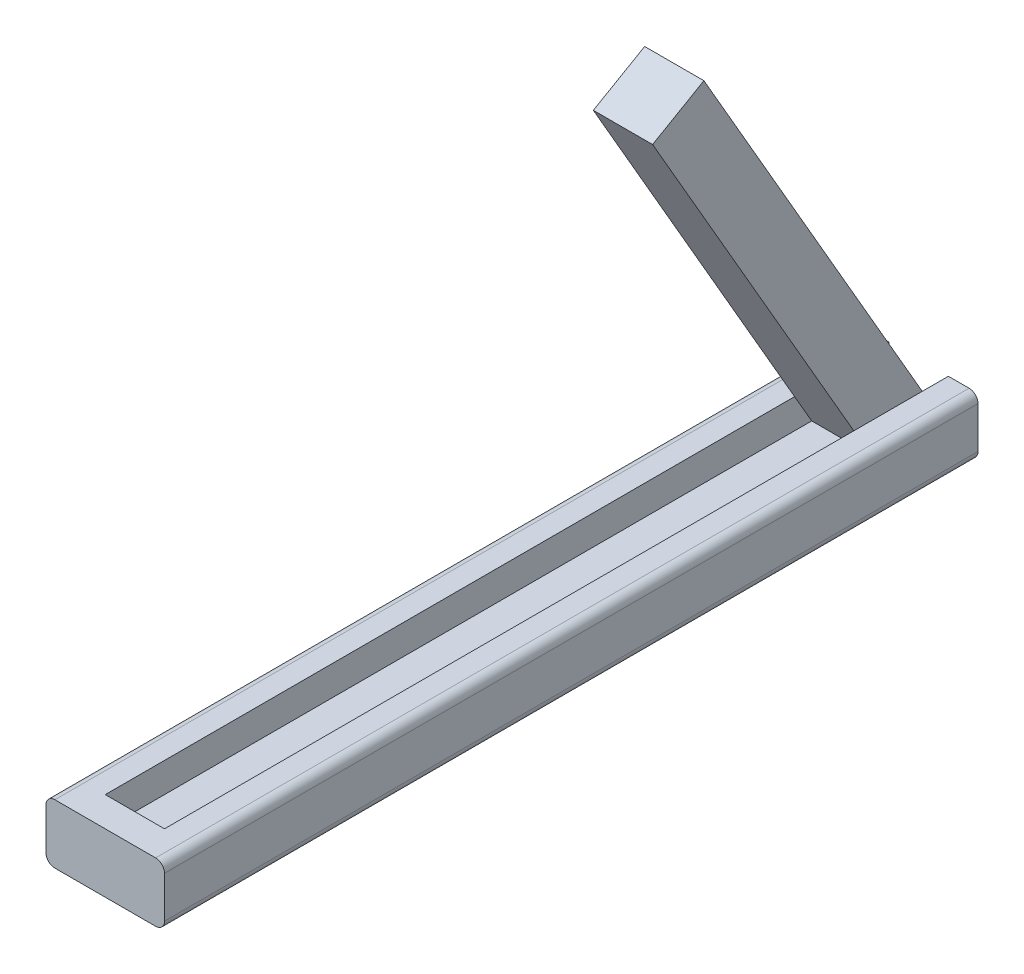
ISO-10303-21;
HEADER;
FILE_DESCRIPTION(('STEP AP214'),'2;1');
FILE_NAME('part.step','',(''),(''),'','','');
FILE_SCHEMA(('AUTOMOTIVE_DESIGN { 1 0 10303 214 1 1 1 1 }'));
ENDSEC;
DATA;
#1=APPLICATION_CONTEXT('core data for automotive mechanical design processes');
#2=APPLICATION_PROTOCOL_DEFINITION('international standard','automotive_design',2000,#1);
#3=PRODUCT_CONTEXT('',#1,'mechanical');
#4=PRODUCT('Part','Part','',(#3));
#5=PRODUCT_RELATED_PRODUCT_CATEGORY('part','',(#4));
#6=PRODUCT_DEFINITION_FORMATION('','',#4);
#7=PRODUCT_DEFINITION_CONTEXT('part definition',#1,'design');
#8=PRODUCT_DEFINITION('design','',#6,#7);
#9=PRODUCT_DEFINITION_SHAPE('','',#8);
#10=(LENGTH_UNIT() NAMED_UNIT(*) SI_UNIT(.MILLI.,.METRE.));
#11=(NAMED_UNIT(*) PLANE_ANGLE_UNIT() SI_UNIT($,.RADIAN.));
#12=(NAMED_UNIT(*) SI_UNIT($,.STERADIAN.) SOLID_ANGLE_UNIT());
#13=UNCERTAINTY_MEASURE_WITH_UNIT(LENGTH_MEASURE(1.E-05),#10,'distance_accuracy_value','');
#14=(GEOMETRIC_REPRESENTATION_CONTEXT(3) GLOBAL_UNCERTAINTY_ASSIGNED_CONTEXT((#13)) GLOBAL_UNIT_ASSIGNED_CONTEXT((#10,
#11,#12)) REPRESENTATION_CONTEXT('',''));
#15=CARTESIAN_POINT('',(0.,0.,0.));
#16=DIRECTION('',(0.,0.,1.));
#17=DIRECTION('',(1.,0.,0.));
#18=AXIS2_PLACEMENT_3D('',#15,#16,#17);
#19=CARTESIAN_POINT('',(0.,168.4772657706,97.2703947449871));
#20=DIRECTION('',(0.,-0.866025403784441,-0.499999999999995));
#21=DIRECTION('',(0.,0.499999999999995,-0.866025403784441));
#22=AXIS2_PLACEMENT_3D('',#19,#20,#21);
#23=PLANE('',#22);
#24=DIRECTION('',(-1.,0.,0.));
#25=VECTOR('',#24,1.);
#26=CARTESIAN_POINT('',(12.7,162.127265770601,108.268917373049));
#27=LINE('',#26,#25);
#28=CARTESIAN_POINT('',(12.7,162.127265770601,108.268917373049));
#29=VERTEX_POINT('',#28);
#30=CARTESIAN_POINT('',(-12.7,162.127265770601,108.268917373049));
#31=VERTEX_POINT('',#30);
#32=EDGE_CURVE('E245',#29,#31,#27,.T.);
#33=ORIENTED_EDGE('',*,*,#32,.F.);
#34=DIRECTION('',(0.,-0.499999999999995,0.866025403784441));
#35=VECTOR('',#34,1.);
#36=CARTESIAN_POINT('',(12.7,162.127265770601,108.268917373049));
#37=LINE('',#36,#35);
#38=CARTESIAN_POINT('',(12.7,174.8272657706,86.2718721169245));
#39=VERTEX_POINT('',#38);
#40=EDGE_CURVE('E242',#39,#29,#37,.T.);
#41=ORIENTED_EDGE('',*,*,#40,.F.);
#42=DIRECTION('',(1.,0.,0.));
#43=VECTOR('',#42,1.);
#44=CARTESIAN_POINT('',(12.7,174.8272657706,86.2718721169247));
#45=LINE('',#44,#43);
#46=CARTESIAN_POINT('',(-12.7,174.8272657706,86.2718721169246));
#47=VERTEX_POINT('',#46);
#48=EDGE_CURVE('E244',#47,#39,#45,.T.);
#49=ORIENTED_EDGE('',*,*,#48,.F.);
#50=DIRECTION('',(0.,0.499999999999995,-0.866025403784441));
#51=VECTOR('',#50,1.);
#52=CARTESIAN_POINT('',(-12.7,162.127265770601,108.268917373049));
#53=LINE('',#52,#51);
#54=EDGE_CURVE('E247',#31,#47,#53,.T.);
#55=ORIENTED_EDGE('',*,*,#54,.F.);
#56=EDGE_LOOP('',(#33,#41,#49,#55));
#57=FACE_BOUND('',#56,.T.);
#58=ADVANCED_FACE('F37',(#57),#23,.F.);
#59=CARTESIAN_POINT('',(21.59,-8.89,330.2));
#60=DIRECTION('',(0.,0.,-1.));
#61=DIRECTION('',(-1.,0.,0.));
#62=AXIS2_PLACEMENT_3D('',#59,#60,#61);
#63=CYLINDRICAL_SURFACE('',#62,3.81);
#64=CARTESIAN_POINT('',(21.59,-8.89,-18.5272400156201));
#65=DIRECTION('',(0.,0.,1.));
#66=DIRECTION('',(1.,0.,0.));
#67=AXIS2_PLACEMENT_3D('',#64,#65,#66);
#68=CIRCLE('',#67,3.81);
#69=CARTESIAN_POINT('',(25.4,-8.89,-18.5272400156201));
#70=VERTEX_POINT('',#69);
#71=CARTESIAN_POINT('',(21.59,-12.7,-18.5272400156201));
#72=VERTEX_POINT('',#71);
#73=EDGE_CURVE('E309',#70,#72,#68,.F.);
#74=ORIENTED_EDGE('',*,*,#73,.F.);
#75=DIRECTION('',(0.,0.,-1.));
#76=VECTOR('',#75,1.);
#77=CARTESIAN_POINT('',(25.4,-8.89,330.2));
#78=LINE('',#77,#76);
#79=CARTESIAN_POINT('',(25.4,-8.89,330.2));
#80=VERTEX_POINT('',#79);
#81=EDGE_CURVE('E230',#80,#70,#78,.T.);
#82=ORIENTED_EDGE('',*,*,#81,.F.);
#83=CARTESIAN_POINT('',(21.59,-8.89,330.2));
#84=DIRECTION('',(0.,0.,-1.));
#85=DIRECTION('',(-1.,0.,0.));
#86=AXIS2_PLACEMENT_3D('',#83,#84,#85);
#87=CIRCLE('',#86,3.81);
#88=CARTESIAN_POINT('',(21.59,-12.7,330.2));
#89=VERTEX_POINT('',#88);
#90=EDGE_CURVE('E224',#89,#80,#87,.F.);
#91=ORIENTED_EDGE('',*,*,#90,.F.);
#92=DIRECTION('',(0.,0.,-1.));
#93=VECTOR('',#92,1.);
#94=CARTESIAN_POINT('',(21.59,-12.7,330.2));
#95=LINE('',#94,#93);
#96=EDGE_CURVE('E210',#72,#89,#95,.F.);
#97=ORIENTED_EDGE('',*,*,#96,.F.);
#98=EDGE_LOOP('',(#74,#82,#91,#97));
#99=FACE_BOUND('',#98,.T.);
#100=ADVANCED_FACE('F345',(#99),#63,.T.);
#101=CARTESIAN_POINT('',(25.4,-12.7,330.2));
#102=DIRECTION('',(-1.,0.,0.));
#103=DIRECTION('',(0.,0.,1.));
#104=AXIS2_PLACEMENT_3D('',#101,#102,#103);
#105=PLANE('',#104);
#106=ORIENTED_EDGE('',*,*,#81,.T.);
#107=DIRECTION('',(0.,1.,0.));
#108=VECTOR('',#107,1.);
#109=CARTESIAN_POINT('',(25.4,-12.7,-18.5272400156201));
#110=LINE('',#109,#108);
#111=CARTESIAN_POINT('',(25.4,8.89,-18.5272400156201));
#112=VERTEX_POINT('',#111);
#113=EDGE_CURVE('E311',#70,#112,#110,.T.);
#114=ORIENTED_EDGE('',*,*,#113,.T.);
#115=DIRECTION('',(0.,0.,-1.));
#116=VECTOR('',#115,1.);
#117=CARTESIAN_POINT('',(25.4,8.89,330.2));
#118=LINE('',#117,#116);
#119=CARTESIAN_POINT('',(25.4,8.89,330.2));
#120=VERTEX_POINT('',#119);
#121=EDGE_CURVE('E228',#112,#120,#118,.F.);
#122=ORIENTED_EDGE('',*,*,#121,.T.);
#123=DIRECTION('',(0.,1.,0.));
#124=VECTOR('',#123,1.);
#125=CARTESIAN_POINT('',(25.4,-12.7,330.2));
#126=LINE('',#125,#124);
#127=EDGE_CURVE('E194',#80,#120,#126,.T.);
#128=ORIENTED_EDGE('',*,*,#127,.F.);
#129=EDGE_LOOP('',(#106,#114,#122,#128));
#130=FACE_BOUND('',#129,.T.);
#131=ADVANCED_FACE('F350',(#130),#105,.F.);
#132=CARTESIAN_POINT('',(-25.4,-12.7,330.2));
#133=DIRECTION('',(1.,0.,0.));
#134=DIRECTION('',(0.,0.,-1.));
#135=AXIS2_PLACEMENT_3D('',#132,#133,#134);
#136=PLANE('',#135);
#137=DIRECTION('',(0.,0.,-1.));
#138=VECTOR('',#137,1.);
#139=CARTESIAN_POINT('',(-25.4,8.89,330.2));
#140=LINE('',#139,#138);
#141=CARTESIAN_POINT('',(-25.4,8.89,330.2));
#142=VERTEX_POINT('',#141);
#143=CARTESIAN_POINT('',(-25.4,8.89,-18.5272400156201));
#144=VERTEX_POINT('',#143);
#145=EDGE_CURVE('E215',#142,#144,#140,.T.);
#146=ORIENTED_EDGE('',*,*,#145,.T.);
#147=DIRECTION('',(0.,-1.,0.));
#148=VECTOR('',#147,1.);
#149=CARTESIAN_POINT('',(-25.4,-12.7,-18.5272400156201));
#150=LINE('',#149,#148);
#151=CARTESIAN_POINT('',(-25.4,-8.89,-18.5272400156201));
#152=VERTEX_POINT('',#151);
#153=EDGE_CURVE('E314',#144,#152,#150,.T.);
#154=ORIENTED_EDGE('',*,*,#153,.T.);
#155=DIRECTION('',(0.,0.,-1.));
#156=VECTOR('',#155,1.);
#157=CARTESIAN_POINT('',(-25.4,-8.89,330.2));
#158=LINE('',#157,#156);
#159=CARTESIAN_POINT('',(-25.4,-8.89,330.2));
#160=VERTEX_POINT('',#159);
#161=EDGE_CURVE('E218',#152,#160,#158,.F.);
#162=ORIENTED_EDGE('',*,*,#161,.T.);
#163=DIRECTION('',(0.,-1.,0.));
#164=VECTOR('',#163,1.);
#165=CARTESIAN_POINT('',(-25.4,-12.7,330.2));
#166=LINE('',#165,#164);
#167=EDGE_CURVE('E204',#142,#160,#166,.T.);
#168=ORIENTED_EDGE('',*,*,#167,.F.);
#169=EDGE_LOOP('',(#146,#154,#162,#168));
#170=FACE_BOUND('',#169,.T.);
#171=ADVANCED_FACE('F332',(#170),#136,.F.);
#172=CARTESIAN_POINT('',(-21.59,-8.89,330.2));
#173=DIRECTION('',(0.,0.,-1.));
#174=DIRECTION('',(-1.,0.,0.));
#175=AXIS2_PLACEMENT_3D('',#172,#173,#174);
#176=CYLINDRICAL_SURFACE('',#175,3.81);
#177=CARTESIAN_POINT('',(-21.59,-8.89,-18.5272400156201));
#178=DIRECTION('',(0.,0.,1.));
#179=DIRECTION('',(1.,0.,0.));
#180=AXIS2_PLACEMENT_3D('',#177,#178,#179);
#181=CIRCLE('',#180,3.81);
#182=CARTESIAN_POINT('',(-21.59,-12.7,-18.5272400156201));
#183=VERTEX_POINT('',#182);
#184=EDGE_CURVE('E282',#183,#152,#181,.F.);
#185=ORIENTED_EDGE('',*,*,#184,.F.);
#186=DIRECTION('',(0.,0.,-1.));
#187=VECTOR('',#186,1.);
#188=CARTESIAN_POINT('',(-21.59,-12.7,330.2));
#189=LINE('',#188,#187);
#190=CARTESIAN_POINT('',(-21.59,-12.7,330.2));
#191=VERTEX_POINT('',#190);
#192=EDGE_CURVE('E212',#191,#183,#189,.T.);
#193=ORIENTED_EDGE('',*,*,#192,.F.);
#194=CARTESIAN_POINT('',(-21.59,-8.89,330.2));
#195=DIRECTION('',(0.,0.,-1.));
#196=DIRECTION('',(-1.,0.,0.));
#197=AXIS2_PLACEMENT_3D('',#194,#195,#196);
#198=CIRCLE('',#197,3.81);
#199=EDGE_CURVE('E226',#160,#191,#198,.F.);
#200=ORIENTED_EDGE('',*,*,#199,.F.);
#201=ORIENTED_EDGE('',*,*,#161,.F.);
#202=EDGE_LOOP('',(#185,#193,#200,#201));
#203=FACE_BOUND('',#202,.T.);
#204=ADVANCED_FACE('F336',(#203),#176,.T.);
#205=CARTESIAN_POINT('',(-25.4,-12.7,330.2));
#206=DIRECTION('',(0.,1.,0.));
#207=DIRECTION('',(0.,0.,1.));
#208=AXIS2_PLACEMENT_3D('',#205,#206,#207);
#209=PLANE('',#208);
#210=ORIENTED_EDGE('',*,*,#192,.T.);
#211=DIRECTION('',(1.,0.,0.));
#212=VECTOR('',#211,1.);
#213=CARTESIAN_POINT('',(-25.4,-12.7,-18.5272400156201));
#214=LINE('',#213,#212);
#215=EDGE_CURVE('E283',#183,#72,#214,.T.);
#216=ORIENTED_EDGE('',*,*,#215,.T.);
#217=ORIENTED_EDGE('',*,*,#96,.T.);
#218=DIRECTION('',(1.,0.,0.));
#219=VECTOR('',#218,1.);
#220=CARTESIAN_POINT('',(-25.4,-12.7,330.2));
#221=LINE('',#220,#219);
#222=EDGE_CURVE('E207',#191,#89,#221,.T.);
#223=ORIENTED_EDGE('',*,*,#222,.F.);
#224=EDGE_LOOP('',(#210,#216,#217,#223));
#225=FACE_BOUND('',#224,.T.);
#226=ADVANCED_FACE('F341',(#225),#209,.F.);
#227=CARTESIAN_POINT('',(21.59,8.89,330.2));
#228=DIRECTION('',(0.,0.,-1.));
#229=DIRECTION('',(-1.,0.,0.));
#230=AXIS2_PLACEMENT_3D('',#227,#228,#229);
#231=CYLINDRICAL_SURFACE('',#230,3.81);
#232=CARTESIAN_POINT('',(21.59,8.89,-18.5272400156201));
#233=DIRECTION('',(0.,0.,1.));
#234=DIRECTION('',(1.,0.,0.));
#235=AXIS2_PLACEMENT_3D('',#232,#233,#234);
#236=CIRCLE('',#235,3.81);
#237=CARTESIAN_POINT('',(21.59,12.7,-18.5272400156201));
#238=VERTEX_POINT('',#237);
#239=EDGE_CURVE('E317',#238,#112,#236,.F.);
#240=ORIENTED_EDGE('',*,*,#239,.F.);
#241=DIRECTION('',(0.,0.,-1.));
#242=VECTOR('',#241,1.);
#243=CARTESIAN_POINT('',(21.59,12.7,330.2));
#244=LINE('',#243,#242);
#245=CARTESIAN_POINT('',(21.59,12.7,330.2));
#246=VERTEX_POINT('',#245);
#247=EDGE_CURVE('E175',#246,#238,#244,.T.);
#248=ORIENTED_EDGE('',*,*,#247,.F.);
#249=CARTESIAN_POINT('',(21.59,8.89,330.2));
#250=DIRECTION('',(0.,0.,-1.));
#251=DIRECTION('',(-1.,0.,0.));
#252=AXIS2_PLACEMENT_3D('',#249,#250,#251);
#253=CIRCLE('',#252,3.81);
#254=EDGE_CURVE('E220',#120,#246,#253,.F.);
#255=ORIENTED_EDGE('',*,*,#254,.F.);
#256=ORIENTED_EDGE('',*,*,#121,.F.);
#257=EDGE_LOOP('',(#240,#248,#255,#256));
#258=FACE_BOUND('',#257,.T.);
#259=ADVANCED_FACE('F353',(#258),#231,.T.);
#260=CARTESIAN_POINT('',(0.,0.,330.2));
#261=DIRECTION('',(0.,0.,-1.));
#262=DIRECTION('',(-1.,0.,0.));
#263=AXIS2_PLACEMENT_3D('',#260,#261,#262);
#264=PLANE('',#263);
#265=ORIENTED_EDGE('',*,*,#167,.T.);
#266=ORIENTED_EDGE('',*,*,#199,.T.);
#267=ORIENTED_EDGE('',*,*,#222,.T.);
#268=ORIENTED_EDGE('',*,*,#90,.T.);
#269=ORIENTED_EDGE('',*,*,#127,.T.);
#270=ORIENTED_EDGE('',*,*,#254,.T.);
#271=DIRECTION('',(-1.,0.,0.));
#272=VECTOR('',#271,1.);
#273=CARTESIAN_POINT('',(-25.4,12.7,330.2));
#274=LINE('',#273,#272);
#275=CARTESIAN_POINT('',(-21.59,12.7,330.2));
#276=VERTEX_POINT('',#275);
#277=EDGE_CURVE('E201',#246,#276,#274,.T.);
#278=ORIENTED_EDGE('',*,*,#277,.T.);
#279=CARTESIAN_POINT('',(-21.59,8.89,330.2));
#280=DIRECTION('',(0.,0.,-1.));
#281=DIRECTION('',(-1.,0.,0.));
#282=AXIS2_PLACEMENT_3D('',#279,#280,#281);
#283=CIRCLE('',#282,3.81);
#284=EDGE_CURVE('E222',#276,#142,#283,.F.);
#285=ORIENTED_EDGE('',*,*,#284,.T.);
#286=EDGE_LOOP('',(#265,#266,#267,#268,#269,#270,#278,#285));
#287=FACE_BOUND('',#286,.T.);
#288=ADVANCED_FACE('F329',(#287),#264,.F.);
#289=CARTESIAN_POINT('',(-21.59,8.89,330.2));
#290=DIRECTION('',(0.,0.,-1.));
#291=DIRECTION('',(-1.,0.,0.));
#292=AXIS2_PLACEMENT_3D('',#289,#290,#291);
#293=CYLINDRICAL_SURFACE('',#292,3.81);
#294=CARTESIAN_POINT('',(-21.59,8.89,-18.5272400156201));
#295=DIRECTION('',(0.,0.,1.));
#296=DIRECTION('',(1.,0.,0.));
#297=AXIS2_PLACEMENT_3D('',#294,#295,#296);
#298=CIRCLE('',#297,3.81);
#299=CARTESIAN_POINT('',(-21.59,12.7,-18.5272400156201));
#300=VERTEX_POINT('',#299);
#301=EDGE_CURVE('E176',#144,#300,#298,.F.);
#302=ORIENTED_EDGE('',*,*,#301,.F.);
#303=ORIENTED_EDGE('',*,*,#145,.F.);
#304=ORIENTED_EDGE('',*,*,#284,.F.);
#305=DIRECTION('',(0.,0.,-1.));
#306=VECTOR('',#305,1.);
#307=CARTESIAN_POINT('',(-21.59,12.7,330.2));
#308=LINE('',#307,#306);
#309=EDGE_CURVE('E234',#300,#276,#308,.F.);
#310=ORIENTED_EDGE('',*,*,#309,.F.);
#311=EDGE_LOOP('',(#302,#303,#304,#310));
#312=FACE_BOUND('',#311,.T.);
#313=ADVANCED_FACE('F325',(#312),#293,.T.);
#314=CARTESIAN_POINT('',(12.7,0.,317.5));
#315=DIRECTION('',(0.,0.,1.));
#316=DIRECTION('',(1.,0.,0.));
#317=AXIS2_PLACEMENT_3D('',#314,#315,#316);
#318=PLANE('',#317);
#319=DIRECTION('',(1.,0.,0.));
#320=VECTOR('',#319,1.);
#321=CARTESIAN_POINT('',(12.7,12.7,317.5));
#322=LINE('',#321,#320);
#323=CARTESIAN_POINT('',(-12.7,12.7,317.5));
#324=VERTEX_POINT('',#323);
#325=CARTESIAN_POINT('',(12.7,12.7,317.5));
#326=VERTEX_POINT('',#325);
#327=EDGE_CURVE('E183',#324,#326,#322,.T.);
#328=ORIENTED_EDGE('',*,*,#327,.T.);
#329=DIRECTION('',(0.,1.,0.));
#330=VECTOR('',#329,1.);
#331=CARTESIAN_POINT('',(12.7,0.,317.5));
#332=LINE('',#331,#330);
#333=CARTESIAN_POINT('',(12.7,0.,317.5));
#334=VERTEX_POINT('',#333);
#335=EDGE_CURVE('E192',#334,#326,#332,.T.);
#336=ORIENTED_EDGE('',*,*,#335,.F.);
#337=DIRECTION('',(1.,0.,0.));
#338=VECTOR('',#337,1.);
#339=CARTESIAN_POINT('',(12.7,0.,317.5));
#340=LINE('',#339,#338);
#341=CARTESIAN_POINT('',(-12.7,0.,317.5));
#342=VERTEX_POINT('',#341);
#343=EDGE_CURVE('E303',#342,#334,#340,.T.);
#344=ORIENTED_EDGE('',*,*,#343,.F.);
#345=DIRECTION('',(0.,1.,0.));
#346=VECTOR('',#345,1.);
#347=CARTESIAN_POINT('',(-12.7,0.,317.5));
#348=LINE('',#347,#346);
#349=EDGE_CURVE('E195',#342,#324,#348,.T.);
#350=ORIENTED_EDGE('',*,*,#349,.T.);
#351=EDGE_LOOP('',(#328,#336,#344,#350));
#352=FACE_BOUND('',#351,.T.);
#353=ADVANCED_FACE('F276',(#352),#318,.F.);
#354=CARTESIAN_POINT('',(-25.4,12.7,330.2));
#355=DIRECTION('',(0.,-1.,0.));
#356=DIRECTION('',(0.,0.,-1.));
#357=AXIS2_PLACEMENT_3D('',#354,#355,#356);
#358=PLANE('',#357);
#359=ORIENTED_EDGE('',*,*,#247,.T.);
#360=DIRECTION('',(-1.,0.,0.));
#361=VECTOR('',#360,1.);
#362=CARTESIAN_POINT('',(-25.4,12.7,-18.5272400156201));
#363=LINE('',#362,#361);
#364=CARTESIAN_POINT('',(12.7,12.7,-18.5272400156201));
#365=VERTEX_POINT('',#364);
#366=EDGE_CURVE('E161',#238,#365,#363,.T.);
#367=ORIENTED_EDGE('',*,*,#366,.T.);
#368=DIRECTION('',(0.,0.,-1.));
#369=VECTOR('',#368,1.);
#370=CARTESIAN_POINT('',(12.7,12.7,317.5));
#371=LINE('',#370,#369);
#372=CARTESIAN_POINT('',(12.7,12.7,-7.33234841870831));
#373=VERTEX_POINT('',#372);
#374=EDGE_CURVE('E172',#373,#365,#371,.T.);
#375=ORIENTED_EDGE('',*,*,#374,.F.);
#376=DIRECTION('',(0.,0.,1.));
#377=VECTOR('',#376,1.);
#378=CARTESIAN_POINT('',(12.7,12.7,-77.0517386859672));
#379=LINE('',#378,#377);
#380=CARTESIAN_POINT('',(12.7,12.7,21.9970452561247));
#381=VERTEX_POINT('',#380);
#382=EDGE_CURVE('E44',#373,#381,#379,.T.);
#383=ORIENTED_EDGE('',*,*,#382,.T.);
#384=EDGE_CURVE('E182',#326,#381,#371,.T.);
#385=ORIENTED_EDGE('',*,*,#384,.F.);
#386=ORIENTED_EDGE('',*,*,#327,.F.);
#387=DIRECTION('',(0.,0.,1.));
#388=VECTOR('',#387,1.);
#389=CARTESIAN_POINT('',(-12.7,12.7,317.5));
#390=LINE('',#389,#388);
#391=CARTESIAN_POINT('',(-12.7,12.7,21.9970452561246));
#392=VERTEX_POINT('',#391);
#393=EDGE_CURVE('E279',#392,#324,#390,.T.);
#394=ORIENTED_EDGE('',*,*,#393,.F.);
#395=CARTESIAN_POINT('',(-12.7,12.7,-7.33234841870831));
#396=VERTEX_POINT('',#395);
#397=EDGE_CURVE('E58',#396,#392,#390,.T.);
#398=ORIENTED_EDGE('',*,*,#397,.F.);
#399=CARTESIAN_POINT('',(-12.7,12.7,-18.5272400156201));
#400=VERTEX_POINT('',#399);
#401=EDGE_CURVE('E188',#400,#396,#390,.T.);
#402=ORIENTED_EDGE('',*,*,#401,.F.);
#403=EDGE_CURVE('E177',#400,#300,#363,.T.);
#404=ORIENTED_EDGE('',*,*,#403,.T.);
#405=ORIENTED_EDGE('',*,*,#309,.T.);
#406=ORIENTED_EDGE('',*,*,#277,.F.);
#407=EDGE_LOOP('',(#359,#367,#375,#383,#385,#386,#394,#398,#402,#404,#405,#406));
#408=FACE_BOUND('',#407,.T.);
#409=ADVANCED_FACE('F170',(#408),#358,.F.);
#410=CARTESIAN_POINT('',(-12.7,-158.857526215618,-77.0517386859672));
#411=DIRECTION('',(1.,0.,0.));
#412=DIRECTION('',(0.,0.,-1.));
#413=AXIS2_PLACEMENT_3D('',#410,#411,#412);
#414=PLANE('',#413);
#415=ORIENTED_EDGE('',*,*,#397,.T.);
#416=DIRECTION('',(0.,0.866025403784441,0.499999999999995));
#417=VECTOR('',#416,1.);
#418=CARTESIAN_POINT('',(-12.7,-158.857526215618,-77.0517386859672));
#419=LINE('',#418,#417);
#420=EDGE_CURVE('E260',#392,#31,#419,.T.);
#421=ORIENTED_EDGE('',*,*,#420,.T.);
#422=ORIENTED_EDGE('',*,*,#54,.T.);
#423=DIRECTION('',(0.,0.866025403784441,0.499999999999995));
#424=VECTOR('',#423,1.);
#425=CARTESIAN_POINT('',(-12.7,-146.157526215618,-99.048783942092));
#426=LINE('',#425,#424);
#427=EDGE_CURVE('E241',#396,#47,#426,.T.);
#428=ORIENTED_EDGE('',*,*,#427,.F.);
#429=EDGE_LOOP('',(#415,#421,#422,#428));
#430=FACE_BOUND('',#429,.T.);
#431=ADVANCED_FACE('F294',(#430),#414,.F.);
#432=CARTESIAN_POINT('',(12.7,-158.857526215618,-77.0517386859672));
#433=DIRECTION('',(-1.,0.,0.));
#434=DIRECTION('',(0.,0.,1.));
#435=AXIS2_PLACEMENT_3D('',#432,#433,#434);
#436=PLANE('',#435);
#437=ORIENTED_EDGE('',*,*,#382,.F.);
#438=DIRECTION('',(0.,0.866025403784441,0.499999999999995));
#439=VECTOR('',#438,1.);
#440=CARTESIAN_POINT('',(12.7,-146.157526215618,-99.048783942092));
#441=LINE('',#440,#439);
#442=EDGE_CURVE('E255',#373,#39,#441,.T.);
#443=ORIENTED_EDGE('',*,*,#442,.T.);
#444=ORIENTED_EDGE('',*,*,#40,.T.);
#445=DIRECTION('',(0.,0.866025403784441,0.499999999999995));
#446=VECTOR('',#445,1.);
#447=CARTESIAN_POINT('',(12.7,-158.857526215618,-77.0517386859672));
#448=LINE('',#447,#446);
#449=EDGE_CURVE('E257',#381,#29,#448,.T.);
#450=ORIENTED_EDGE('',*,*,#449,.F.);
#451=EDGE_LOOP('',(#437,#443,#444,#450));
#452=FACE_BOUND('',#451,.T.);
#453=ADVANCED_FACE('F379',(#452),#436,.F.);
#454=CARTESIAN_POINT('',(12.7,0.,317.5));
#455=DIRECTION('',(1.,0.,0.));
#456=DIRECTION('',(0.,0.,-1.));
#457=AXIS2_PLACEMENT_3D('',#454,#455,#456);
#458=PLANE('',#457);
#459=ORIENTED_EDGE('',*,*,#384,.T.);
#460=CARTESIAN_POINT('',(12.7,0.,14.6646968374164));
#461=VERTEX_POINT('',#460);
#462=EDGE_CURVE('E258',#461,#381,#448,.T.);
#463=ORIENTED_EDGE('',*,*,#462,.F.);
#464=DIRECTION('',(0.,0.,-1.));
#465=VECTOR('',#464,1.);
#466=CARTESIAN_POINT('',(12.7,0.,317.5));
#467=LINE('',#466,#465);
#468=EDGE_CURVE('E198',#334,#461,#467,.T.);
#469=ORIENTED_EDGE('',*,*,#468,.F.);
#470=ORIENTED_EDGE('',*,*,#335,.T.);
#471=EDGE_LOOP('',(#459,#463,#469,#470));
#472=FACE_BOUND('',#471,.T.);
#473=ADVANCED_FACE('F270',(#472),#458,.F.);
#474=CARTESIAN_POINT('',(0.,0.,0.));
#475=DIRECTION('',(0.,1.,0.));
#476=DIRECTION('',(0.,0.,1.));
#477=AXIS2_PLACEMENT_3D('',#474,#475,#476);
#478=PLANE('',#477);
#479=DIRECTION('',(1.,0.,0.));
#480=VECTOR('',#479,1.);
#481=CARTESIAN_POINT('',(12.7,0.,14.6646968374164));
#482=LINE('',#481,#480);
#483=CARTESIAN_POINT('',(-12.7,0.,14.6646968374164));
#484=VERTEX_POINT('',#483);
#485=EDGE_CURVE('E239',#484,#461,#482,.T.);
#486=ORIENTED_EDGE('',*,*,#485,.F.);
#487=DIRECTION('',(0.,0.,1.));
#488=VECTOR('',#487,1.);
#489=CARTESIAN_POINT('',(-12.7,0.,317.5));
#490=LINE('',#489,#488);
#491=EDGE_CURVE('E186',#484,#342,#490,.T.);
#492=ORIENTED_EDGE('',*,*,#491,.T.);
#493=ORIENTED_EDGE('',*,*,#343,.T.);
#494=ORIENTED_EDGE('',*,*,#468,.T.);
#495=EDGE_LOOP('',(#486,#492,#493,#494));
#496=FACE_BOUND('',#495,.T.);
#497=ADVANCED_FACE('F392',(#496),#478,.T.);
#498=CARTESIAN_POINT('',(-12.7,0.,317.5));
#499=DIRECTION('',(-1.,0.,0.));
#500=DIRECTION('',(0.,0.,1.));
#501=AXIS2_PLACEMENT_3D('',#498,#499,#500);
#502=PLANE('',#501);
#503=ORIENTED_EDGE('',*,*,#491,.F.);
#504=EDGE_CURVE('E251',#484,#392,#419,.T.);
#505=ORIENTED_EDGE('',*,*,#504,.T.);
#506=ORIENTED_EDGE('',*,*,#393,.T.);
#507=ORIENTED_EDGE('',*,*,#349,.F.);
#508=EDGE_LOOP('',(#503,#505,#506,#507));
#509=FACE_BOUND('',#508,.T.);
#510=ADVANCED_FACE('F385',(#509),#502,.F.);
#511=CARTESIAN_POINT('',(12.7,-158.857526215618,-77.0517386859672));
#512=DIRECTION('',(0.,0.499999999999995,-0.866025403784441));
#513=DIRECTION('',(0.,0.866025403784441,0.499999999999995));
#514=AXIS2_PLACEMENT_3D('',#511,#512,#513);
#515=PLANE('',#514);
#516=ORIENTED_EDGE('',*,*,#504,.F.);
#517=ORIENTED_EDGE('',*,*,#485,.T.);
#518=ORIENTED_EDGE('',*,*,#462,.T.);
#519=ORIENTED_EDGE('',*,*,#449,.T.);
#520=ORIENTED_EDGE('',*,*,#32,.T.);
#521=ORIENTED_EDGE('',*,*,#420,.F.);
#522=EDGE_LOOP('',(#516,#517,#518,#519,#520,#521));
#523=FACE_BOUND('',#522,.T.);
#524=ADVANCED_FACE('F383',(#523),#515,.F.);
#525=CARTESIAN_POINT('',(-12.7,0.,-18.5272400156201));
#526=VERTEX_POINT('',#525);
#527=CARTESIAN_POINT('',(-12.7,0.,-14.6646968374165));
#528=VERTEX_POINT('',#527);
#529=EDGE_CURVE('E302',#526,#528,#490,.T.);
#530=ORIENTED_EDGE('',*,*,#529,.F.);
#531=DIRECTION('',(0.,1.,0.));
#532=VECTOR('',#531,1.);
#533=CARTESIAN_POINT('',(-12.7,0.,-18.5272400156201));
#534=LINE('',#533,#532);
#535=EDGE_CURVE('E291',#526,#400,#534,.T.);
#536=ORIENTED_EDGE('',*,*,#535,.T.);
#537=ORIENTED_EDGE('',*,*,#401,.T.);
#538=EDGE_CURVE('E252',#528,#396,#426,.T.);
#539=ORIENTED_EDGE('',*,*,#538,.F.);
#540=EDGE_LOOP('',(#530,#536,#537,#539));
#541=FACE_BOUND('',#540,.T.);
#542=ADVANCED_FACE('F290',(#541),#502,.F.);
#543=DIRECTION('',(1.,0.,0.));
#544=VECTOR('',#543,1.);
#545=CARTESIAN_POINT('',(0.,0.,-18.5272400156201));
#546=LINE('',#545,#544);
#547=CARTESIAN_POINT('',(12.7,0.,-18.52724001562));
#548=VERTEX_POINT('',#547);
#549=EDGE_CURVE('E51',#526,#548,#546,.T.);
#550=ORIENTED_EDGE('',*,*,#549,.F.);
#551=ORIENTED_EDGE('',*,*,#529,.T.);
#552=DIRECTION('',(-1.,0.,0.));
#553=VECTOR('',#552,1.);
#554=CARTESIAN_POINT('',(12.7,0.,-14.6646968374165));
#555=LINE('',#554,#553);
#556=CARTESIAN_POINT('',(12.7,0.,-14.6646968374164));
#557=VERTEX_POINT('',#556);
#558=EDGE_CURVE('E236',#557,#528,#555,.T.);
#559=ORIENTED_EDGE('',*,*,#558,.F.);
#560=EDGE_CURVE('E301',#557,#548,#467,.T.);
#561=ORIENTED_EDGE('',*,*,#560,.T.);
#562=EDGE_LOOP('',(#550,#551,#559,#561));
#563=FACE_BOUND('',#562,.T.);
#564=ADVANCED_FACE('F300',(#563),#478,.T.);
#565=ORIENTED_EDGE('',*,*,#374,.T.);
#566=DIRECTION('',(0.,-1.,0.));
#567=VECTOR('',#566,1.);
#568=CARTESIAN_POINT('',(12.7,0.,-18.5272400156201));
#569=LINE('',#568,#567);
#570=EDGE_CURVE('E12',#365,#548,#569,.T.);
#571=ORIENTED_EDGE('',*,*,#570,.T.);
#572=ORIENTED_EDGE('',*,*,#560,.F.);
#573=EDGE_CURVE('E181',#557,#373,#441,.T.);
#574=ORIENTED_EDGE('',*,*,#573,.T.);
#575=EDGE_LOOP('',(#565,#571,#572,#574));
#576=FACE_BOUND('',#575,.T.);
#577=ADVANCED_FACE('F180',(#576),#458,.F.);
#578=CARTESIAN_POINT('',(12.7,-146.157526215618,-99.048783942092));
#579=DIRECTION('',(0.,-0.499999999999995,0.866025403784441));
#580=DIRECTION('',(0.,-0.866025403784441,-0.499999999999995));
#581=AXIS2_PLACEMENT_3D('',#578,#579,#580);
#582=PLANE('',#581);
#583=ORIENTED_EDGE('',*,*,#573,.F.);
#584=ORIENTED_EDGE('',*,*,#558,.T.);
#585=ORIENTED_EDGE('',*,*,#538,.T.);
#586=ORIENTED_EDGE('',*,*,#427,.T.);
#587=ORIENTED_EDGE('',*,*,#48,.T.);
#588=ORIENTED_EDGE('',*,*,#442,.F.);
#589=EDGE_LOOP('',(#583,#584,#585,#586,#587,#588));
#590=FACE_BOUND('',#589,.T.);
#591=ADVANCED_FACE('F297',(#590),#582,.F.);
#592=CARTESIAN_POINT('',(0.,0.,-18.5272400156201));
#593=DIRECTION('',(0.,0.,1.));
#594=DIRECTION('',(1.,0.,0.));
#595=AXIS2_PLACEMENT_3D('',#592,#593,#594);
#596=PLANE('',#595);
#597=ORIENTED_EDGE('',*,*,#215,.F.);
#598=ORIENTED_EDGE('',*,*,#184,.T.);
#599=ORIENTED_EDGE('',*,*,#153,.F.);
#600=ORIENTED_EDGE('',*,*,#301,.T.);
#601=ORIENTED_EDGE('',*,*,#403,.F.);
#602=ORIENTED_EDGE('',*,*,#535,.F.);
#603=ORIENTED_EDGE('',*,*,#549,.T.);
#604=ORIENTED_EDGE('',*,*,#570,.F.);
#605=ORIENTED_EDGE('',*,*,#366,.F.);
#606=ORIENTED_EDGE('',*,*,#239,.T.);
#607=ORIENTED_EDGE('',*,*,#113,.F.);
#608=ORIENTED_EDGE('',*,*,#73,.T.);
#609=EDGE_LOOP('',(#597,#598,#599,#600,#601,#602,#603,#604,#605,#606,#607,#608));
#610=FACE_BOUND('',#609,.T.);
#611=ADVANCED_FACE('F160',(#610),#596,.F.);
#612=CLOSED_SHELL('',(#58,#100,#131,#171,#204,#226,#259,#288,#313,#353,#409,#431,#453,#473,#497,
#510,#524,#542,#564,#577,#591,#611));
#613=MANIFOLD_SOLID_BREP('B2',#612);
#614=ADVANCED_BREP_SHAPE_REPRESENTATION('',(#18,#613),#14);
#615=SHAPE_DEFINITION_REPRESENTATION(#9,#614);
ENDSEC;
END-ISO-10303-21;
